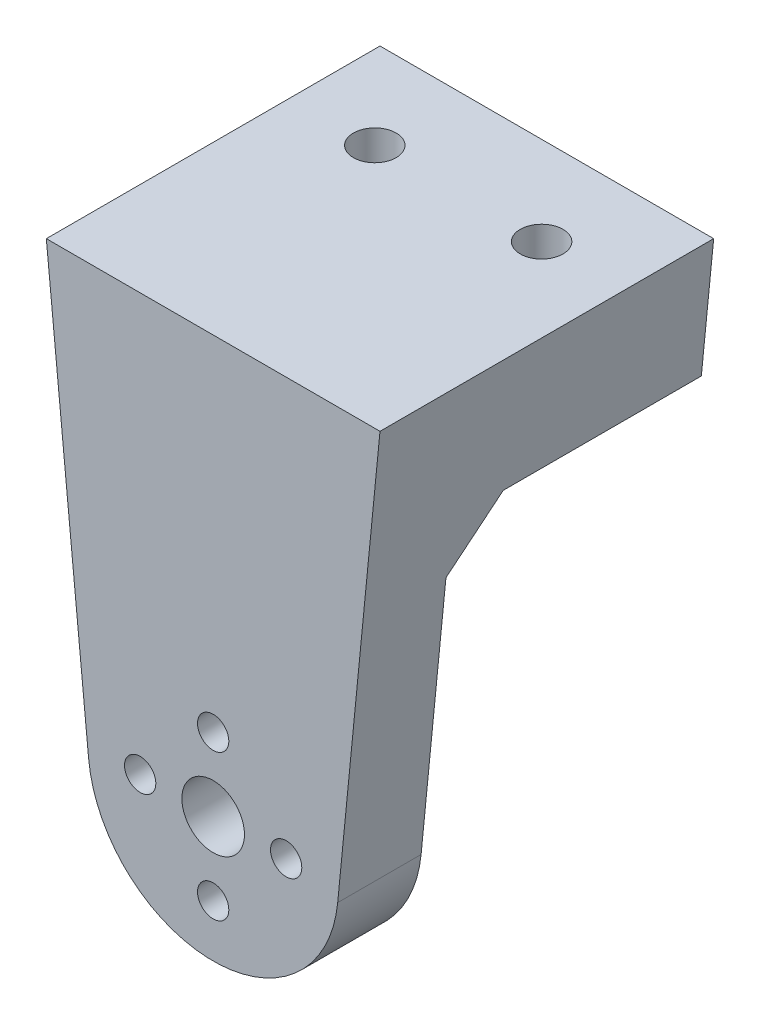
ISO-10303-21;
HEADER;
FILE_DESCRIPTION(('STEP AP214'),'2;1');
FILE_NAME('part.step','',(''),(''),'','','');
FILE_SCHEMA(('AUTOMOTIVE_DESIGN { 1 0 10303 214 1 1 1 1 }'));
ENDSEC;
DATA;
#1=APPLICATION_CONTEXT('core data for automotive mechanical design processes');
#2=APPLICATION_PROTOCOL_DEFINITION('international standard','automotive_design',2000,#1);
#3=PRODUCT_CONTEXT('',#1,'mechanical');
#4=PRODUCT('Part','Part','',(#3));
#5=PRODUCT_RELATED_PRODUCT_CATEGORY('part','',(#4));
#6=PRODUCT_DEFINITION_FORMATION('','',#4);
#7=PRODUCT_DEFINITION_CONTEXT('part definition',#1,'design');
#8=PRODUCT_DEFINITION('design','',#6,#7);
#9=PRODUCT_DEFINITION_SHAPE('','',#8);
#10=(LENGTH_UNIT() NAMED_UNIT(*) SI_UNIT(.MILLI.,.METRE.));
#11=(NAMED_UNIT(*) PLANE_ANGLE_UNIT() SI_UNIT($,.RADIAN.));
#12=(NAMED_UNIT(*) SI_UNIT($,.STERADIAN.) SOLID_ANGLE_UNIT());
#13=UNCERTAINTY_MEASURE_WITH_UNIT(LENGTH_MEASURE(1.E-05),#10,'distance_accuracy_value','');
#14=(GEOMETRIC_REPRESENTATION_CONTEXT(3) GLOBAL_UNCERTAINTY_ASSIGNED_CONTEXT((#13)) GLOBAL_UNIT_ASSIGNED_CONTEXT((#10,
#11,#12)) REPRESENTATION_CONTEXT('',''));
#15=CARTESIAN_POINT('',(0.,0.,0.));
#16=DIRECTION('',(0.,0.,1.));
#17=DIRECTION('',(1.,0.,0.));
#18=AXIS2_PLACEMENT_3D('',#15,#16,#17);
#19=CARTESIAN_POINT('',(0.,0.,0.));
#20=DIRECTION('',(0.,0.,1.));
#21=DIRECTION('',(1.,0.,0.));
#22=AXIS2_PLACEMENT_3D('',#19,#20,#21);
#23=PLANE('',#22);
#24=CARTESIAN_POINT('',(0.,0.,0.));
#25=DIRECTION('',(0.,0.,-1.));
#26=DIRECTION('',(-1.,0.,0.));
#27=AXIS2_PLACEMENT_3D('',#24,#25,#26);
#28=CIRCLE('',#27,3.);
#29=CARTESIAN_POINT('',(-3.,0.,0.));
#30=VERTEX_POINT('',#29);
#31=EDGE_CURVE('E116',#30,#30,#28,.T.);
#32=ORIENTED_EDGE('',*,*,#31,.F.);
#33=EDGE_LOOP('',(#32));
#34=FACE_BOUND('',#33,.T.);
#35=CARTESIAN_POINT('',(7.,0.,0.));
#36=DIRECTION('',(0.,0.,1.));
#37=DIRECTION('',(1.,0.,0.));
#38=AXIS2_PLACEMENT_3D('',#35,#36,#37);
#39=CIRCLE('',#38,1.5);
#40=CARTESIAN_POINT('',(8.5,0.,0.));
#41=VERTEX_POINT('',#40);
#42=EDGE_CURVE('E158',#41,#41,#39,.T.);
#43=ORIENTED_EDGE('',*,*,#42,.T.);
#44=EDGE_LOOP('',(#43));
#45=FACE_BOUND('',#44,.T.);
#46=CARTESIAN_POINT('',(0.,-7.,0.));
#47=DIRECTION('',(0.,0.,1.));
#48=DIRECTION('',(1.,0.,0.));
#49=AXIS2_PLACEMENT_3D('',#46,#47,#48);
#50=CIRCLE('',#49,1.5);
#51=CARTESIAN_POINT('',(1.5,-7.,0.));
#52=VERTEX_POINT('',#51);
#53=EDGE_CURVE('E155',#52,#52,#50,.T.);
#54=ORIENTED_EDGE('',*,*,#53,.T.);
#55=EDGE_LOOP('',(#54));
#56=FACE_BOUND('',#55,.T.);
#57=CARTESIAN_POINT('',(-7.,0.,0.));
#58=DIRECTION('',(0.,0.,1.));
#59=DIRECTION('',(1.,0.,0.));
#60=AXIS2_PLACEMENT_3D('',#57,#58,#59);
#61=CIRCLE('',#60,1.5);
#62=CARTESIAN_POINT('',(-5.5,0.,0.));
#63=VERTEX_POINT('',#62);
#64=EDGE_CURVE('E123',#63,#63,#61,.T.);
#65=ORIENTED_EDGE('',*,*,#64,.T.);
#66=EDGE_LOOP('',(#65));
#67=FACE_BOUND('',#66,.T.);
#68=CARTESIAN_POINT('',(0.,7.,0.));
#69=DIRECTION('',(0.,0.,1.));
#70=DIRECTION('',(1.,0.,0.));
#71=AXIS2_PLACEMENT_3D('',#68,#69,#70);
#72=CIRCLE('',#71,1.5);
#73=CARTESIAN_POINT('',(1.5,7.,0.));
#74=VERTEX_POINT('',#73);
#75=EDGE_CURVE('E120',#74,#74,#72,.T.);
#76=ORIENTED_EDGE('',*,*,#75,.T.);
#77=EDGE_LOOP('',(#76));
#78=FACE_BOUND('',#77,.T.);
#79=DIRECTION('',(-0.0980717390616762,0.99517934765419,0.));
#80=VECTOR('',#79,1.);
#81=CARTESIAN_POINT('',(-11.9421521718503,-1.17686086874011,0.));
#82=LINE('',#81,#80);
#83=CARTESIAN_POINT('',(-11.9421521718503,-1.17686086874012,0.));
#84=VERTEX_POINT('',#83);
#85=CARTESIAN_POINT('',(-14.324704418376,23.,0.));
#86=VERTEX_POINT('',#85);
#87=EDGE_CURVE('E132',#84,#86,#82,.T.);
#88=ORIENTED_EDGE('',*,*,#87,.T.);
#89=DIRECTION('',(1.,0.,0.));
#90=VECTOR('',#89,1.);
#91=CARTESIAN_POINT('',(14.8174384129713,23.,0.));
#92=LINE('',#91,#90);
#93=CARTESIAN_POINT('',(14.324704418376,23.,0.));
#94=VERTEX_POINT('',#93);
#95=EDGE_CURVE('E59',#86,#94,#92,.T.);
#96=ORIENTED_EDGE('',*,*,#95,.T.);
#97=DIRECTION('',(-0.0980717390616759,-0.99517934765419,0.));
#98=VECTOR('',#97,1.);
#99=CARTESIAN_POINT('',(11.9421521718503,-1.17686086874011,0.));
#100=LINE('',#99,#98);
#101=CARTESIAN_POINT('',(11.9421521718503,-1.17686086874011,0.));
#102=VERTEX_POINT('',#101);
#103=EDGE_CURVE('E164',#94,#102,#100,.T.);
#104=ORIENTED_EDGE('',*,*,#103,.T.);
#105=CARTESIAN_POINT('',(0.,0.,0.));
#106=DIRECTION('',(0.,0.,1.));
#107=DIRECTION('',(1.,0.,0.));
#108=AXIS2_PLACEMENT_3D('',#105,#106,#107);
#109=CIRCLE('',#108,12.);
#110=EDGE_CURVE('E161',#84,#102,#109,.T.);
#111=ORIENTED_EDGE('',*,*,#110,.F.);
#112=EDGE_LOOP('',(#88,#96,#104,#111));
#113=FACE_BOUND('',#112,.T.);
#114=ADVANCED_FACE('F37',(#34,#45,#56,#67,#78,#113),#23,.F.);
#115=CARTESIAN_POINT('',(0.,0.,8.));
#116=DIRECTION('',(0.,0.,-1.));
#117=DIRECTION('',(-1.,0.,0.));
#118=AXIS2_PLACEMENT_3D('',#115,#116,#117);
#119=CYLINDRICAL_SURFACE('',#118,12.);
#120=ORIENTED_EDGE('',*,*,#110,.T.);
#121=DIRECTION('',(0.,0.,-1.));
#122=VECTOR('',#121,1.);
#123=CARTESIAN_POINT('',(11.9421521718503,-1.17686086874011,8.));
#124=LINE('',#123,#122);
#125=CARTESIAN_POINT('',(11.9421521718503,-1.17686086874011,8.));
#126=VERTEX_POINT('',#125);
#127=EDGE_CURVE('E172',#126,#102,#124,.T.);
#128=ORIENTED_EDGE('',*,*,#127,.F.);
#129=CARTESIAN_POINT('',(0.,0.,8.));
#130=DIRECTION('',(0.,0.,1.));
#131=DIRECTION('',(1.,0.,0.));
#132=AXIS2_PLACEMENT_3D('',#129,#130,#131);
#133=CIRCLE('',#132,12.);
#134=CARTESIAN_POINT('',(-11.9421521718503,-1.17686086874012,8.));
#135=VERTEX_POINT('',#134);
#136=EDGE_CURVE('E141',#135,#126,#133,.T.);
#137=ORIENTED_EDGE('',*,*,#136,.F.);
#138=DIRECTION('',(0.,0.,-1.));
#139=VECTOR('',#138,1.);
#140=CARTESIAN_POINT('',(-11.9421521718503,-1.17686086874012,8.));
#141=LINE('',#140,#139);
#142=EDGE_CURVE('E151',#135,#84,#141,.T.);
#143=ORIENTED_EDGE('',*,*,#142,.T.);
#144=EDGE_LOOP('',(#120,#128,#137,#143));
#145=FACE_BOUND('',#144,.T.);
#146=ADVANCED_FACE('F211',(#145),#119,.T.);
#147=CARTESIAN_POINT('',(11.9421521718503,-1.17686086874011,8.));
#148=DIRECTION('',(0.99517934765419,-0.0980717390616759,0.));
#149=DIRECTION('',(0.0980717390616759,0.99517934765419,0.));
#150=AXIS2_PLACEMENT_3D('',#147,#148,#149);
#151=PLANE('',#150);
#152=ORIENTED_EDGE('',*,*,#103,.F.);
#153=DIRECTION('',(-0.0695145420373916,-0.705396246249341,0.705396246249348));
#154=VECTOR('',#153,1.);
#155=CARTESIAN_POINT('',(14.6742346406592,26.5468450128987,-3.54684501289869));
#156=LINE('',#155,#154);
#157=CARTESIAN_POINT('',(14.8174384129713,28.,-5.00000000000004));
#158=VERTEX_POINT('',#157);
#159=EDGE_CURVE('E11',#94,#158,#156,.F.);
#160=ORIENTED_EDGE('',*,*,#159,.T.);
#161=DIRECTION('',(0.,0.,1.));
#162=VECTOR('',#161,1.);
#163=CARTESIAN_POINT('',(14.8174384129713,28.,-24.));
#164=LINE('',#163,#162);
#165=CARTESIAN_POINT('',(14.8174384129713,28.,-24.));
#166=VERTEX_POINT('',#165);
#167=EDGE_CURVE('E101',#166,#158,#164,.T.);
#168=ORIENTED_EDGE('',*,*,#167,.F.);
#169=DIRECTION('',(-0.0980717390616759,-0.99517934765419,0.));
#170=VECTOR('',#169,1.);
#171=CARTESIAN_POINT('',(16.,40.,-24.));
#172=LINE('',#171,#170);
#173=CARTESIAN_POINT('',(16.,40.,-24.));
#174=VERTEX_POINT('',#173);
#175=EDGE_CURVE('E108',#174,#166,#172,.T.);
#176=ORIENTED_EDGE('',*,*,#175,.F.);
#177=DIRECTION('',(0.,0.,-1.));
#178=VECTOR('',#177,1.);
#179=CARTESIAN_POINT('',(16.,40.,8.));
#180=LINE('',#179,#178);
#181=CARTESIAN_POINT('',(16.,40.,8.));
#182=VERTEX_POINT('',#181);
#183=EDGE_CURVE('E170',#182,#174,#180,.T.);
#184=ORIENTED_EDGE('',*,*,#183,.F.);
#185=DIRECTION('',(-0.0980717390616759,-0.99517934765419,0.));
#186=VECTOR('',#185,1.);
#187=CARTESIAN_POINT('',(11.9421521718503,-1.17686086874011,8.));
#188=LINE('',#187,#186);
#189=EDGE_CURVE('E143',#182,#126,#188,.T.);
#190=ORIENTED_EDGE('',*,*,#189,.T.);
#191=ORIENTED_EDGE('',*,*,#127,.T.);
#192=EDGE_LOOP('',(#152,#160,#168,#176,#184,#190,#191));
#193=FACE_BOUND('',#192,.T.);
#194=ADVANCED_FACE('F118',(#193),#151,.T.);
#195=CARTESIAN_POINT('',(0.,40.,8.));
#196=DIRECTION('',(0.,1.,0.));
#197=DIRECTION('',(-1.,0.,0.));
#198=AXIS2_PLACEMENT_3D('',#195,#196,#197);
#199=PLANE('',#198);
#200=CARTESIAN_POINT('',(-8.00000000000001,40.,-15.5));
#201=DIRECTION('',(0.,1.,0.));
#202=DIRECTION('',(-1.,0.,0.));
#203=AXIS2_PLACEMENT_3D('',#200,#201,#202);
#204=CIRCLE('',#203,2.05);
#205=CARTESIAN_POINT('',(-10.05,40.,-15.5));
#206=VERTEX_POINT('',#205);
#207=EDGE_CURVE('E193',#206,#206,#204,.F.);
#208=ORIENTED_EDGE('',*,*,#207,.T.);
#209=EDGE_LOOP('',(#208));
#210=FACE_BOUND('',#209,.T.);
#211=CARTESIAN_POINT('',(7.99999999999999,40.,-15.5));
#212=DIRECTION('',(0.,-1.,0.));
#213=DIRECTION('',(1.,0.,0.));
#214=AXIS2_PLACEMENT_3D('',#211,#212,#213);
#215=CIRCLE('',#214,2.05);
#216=CARTESIAN_POINT('',(10.05,40.,-15.5));
#217=VERTEX_POINT('',#216);
#218=EDGE_CURVE('E190',#217,#217,#215,.T.);
#219=ORIENTED_EDGE('',*,*,#218,.T.);
#220=EDGE_LOOP('',(#219));
#221=FACE_BOUND('',#220,.T.);
#222=ORIENTED_EDGE('',*,*,#183,.T.);
#223=DIRECTION('',(1.,0.,0.));
#224=VECTOR('',#223,1.);
#225=CARTESIAN_POINT('',(-16.,40.,-24.));
#226=LINE('',#225,#224);
#227=CARTESIAN_POINT('',(-16.,40.,-24.));
#228=VERTEX_POINT('',#227);
#229=EDGE_CURVE('E114',#228,#174,#226,.T.);
#230=ORIENTED_EDGE('',*,*,#229,.F.);
#231=DIRECTION('',(0.,0.,-1.));
#232=VECTOR('',#231,1.);
#233=CARTESIAN_POINT('',(-16.,40.,8.));
#234=LINE('',#233,#232);
#235=CARTESIAN_POINT('',(-16.,40.,8.));
#236=VERTEX_POINT('',#235);
#237=EDGE_CURVE('E168',#236,#228,#234,.T.);
#238=ORIENTED_EDGE('',*,*,#237,.F.);
#239=DIRECTION('',(1.,0.,0.));
#240=VECTOR('',#239,1.);
#241=CARTESIAN_POINT('',(0.,40.,8.));
#242=LINE('',#241,#240);
#243=EDGE_CURVE('E146',#236,#182,#242,.T.);
#244=ORIENTED_EDGE('',*,*,#243,.T.);
#245=EDGE_LOOP('',(#222,#230,#238,#244));
#246=FACE_BOUND('',#245,.T.);
#247=ADVANCED_FACE('F228',(#210,#221,#246),#199,.T.);
#248=CARTESIAN_POINT('',(7.,0.,8.));
#249=DIRECTION('',(0.,0.,-1.));
#250=DIRECTION('',(-1.,0.,0.));
#251=AXIS2_PLACEMENT_3D('',#248,#249,#250);
#252=CYLINDRICAL_SURFACE('',#251,1.5);
#253=CARTESIAN_POINT('',(7.,0.,8.));
#254=DIRECTION('',(0.,0.,1.));
#255=DIRECTION('',(1.,0.,0.));
#256=AXIS2_PLACEMENT_3D('',#253,#254,#255);
#257=CIRCLE('',#256,1.5);
#258=CARTESIAN_POINT('',(8.5,0.,8.));
#259=VERTEX_POINT('',#258);
#260=EDGE_CURVE('E138',#259,#259,#257,.T.);
#261=ORIENTED_EDGE('',*,*,#260,.T.);
#262=EDGE_LOOP('',(#261));
#263=FACE_BOUND('',#262,.T.);
#264=ORIENTED_EDGE('',*,*,#42,.F.);
#265=EDGE_LOOP('',(#264));
#266=FACE_BOUND('',#265,.T.);
#267=ADVANCED_FACE('F231',(#263,#266),#252,.F.);
#268=CARTESIAN_POINT('',(0.,-7.,8.));
#269=DIRECTION('',(0.,0.,-1.));
#270=DIRECTION('',(-1.,0.,0.));
#271=AXIS2_PLACEMENT_3D('',#268,#269,#270);
#272=CYLINDRICAL_SURFACE('',#271,1.5);
#273=CARTESIAN_POINT('',(0.,-7.,8.));
#274=DIRECTION('',(0.,0.,1.));
#275=DIRECTION('',(1.,0.,0.));
#276=AXIS2_PLACEMENT_3D('',#273,#274,#275);
#277=CIRCLE('',#276,1.5);
#278=CARTESIAN_POINT('',(1.5,-7.,8.));
#279=VERTEX_POINT('',#278);
#280=EDGE_CURVE('E135',#279,#279,#277,.T.);
#281=ORIENTED_EDGE('',*,*,#280,.T.);
#282=EDGE_LOOP('',(#281));
#283=FACE_BOUND('',#282,.T.);
#284=ORIENTED_EDGE('',*,*,#53,.F.);
#285=EDGE_LOOP('',(#284));
#286=FACE_BOUND('',#285,.T.);
#287=ADVANCED_FACE('F237',(#283,#286),#272,.F.);
#288=CARTESIAN_POINT('',(-7.,0.,8.));
#289=DIRECTION('',(0.,0.,-1.));
#290=DIRECTION('',(-1.,0.,0.));
#291=AXIS2_PLACEMENT_3D('',#288,#289,#290);
#292=CYLINDRICAL_SURFACE('',#291,1.5);
#293=CARTESIAN_POINT('',(-7.,0.,8.));
#294=DIRECTION('',(0.,0.,1.));
#295=DIRECTION('',(1.,0.,0.));
#296=AXIS2_PLACEMENT_3D('',#293,#294,#295);
#297=CIRCLE('',#296,1.5);
#298=CARTESIAN_POINT('',(-5.5,0.,8.));
#299=VERTEX_POINT('',#298);
#300=EDGE_CURVE('E131',#299,#299,#297,.T.);
#301=ORIENTED_EDGE('',*,*,#300,.T.);
#302=EDGE_LOOP('',(#301));
#303=FACE_BOUND('',#302,.T.);
#304=ORIENTED_EDGE('',*,*,#64,.F.);
#305=EDGE_LOOP('',(#304));
#306=FACE_BOUND('',#305,.T.);
#307=ADVANCED_FACE('F241',(#303,#306),#292,.F.);
#308=CARTESIAN_POINT('',(0.,7.,8.));
#309=DIRECTION('',(0.,0.,-1.));
#310=DIRECTION('',(-1.,0.,0.));
#311=AXIS2_PLACEMENT_3D('',#308,#309,#310);
#312=CYLINDRICAL_SURFACE('',#311,1.5);
#313=CARTESIAN_POINT('',(0.,7.,8.));
#314=DIRECTION('',(0.,0.,1.));
#315=DIRECTION('',(1.,0.,0.));
#316=AXIS2_PLACEMENT_3D('',#313,#314,#315);
#317=CIRCLE('',#316,1.5);
#318=CARTESIAN_POINT('',(1.5,7.,8.));
#319=VERTEX_POINT('',#318);
#320=EDGE_CURVE('E128',#319,#319,#317,.T.);
#321=ORIENTED_EDGE('',*,*,#320,.T.);
#322=EDGE_LOOP('',(#321));
#323=FACE_BOUND('',#322,.T.);
#324=ORIENTED_EDGE('',*,*,#75,.F.);
#325=EDGE_LOOP('',(#324));
#326=FACE_BOUND('',#325,.T.);
#327=ADVANCED_FACE('F227',(#323,#326),#312,.F.);
#328=CARTESIAN_POINT('',(-11.9421521718503,-1.17686086874011,8.));
#329=DIRECTION('',(-0.99517934765419,-0.0980717390616762,0.));
#330=DIRECTION('',(0.0980717390616762,-0.99517934765419,0.));
#331=AXIS2_PLACEMENT_3D('',#328,#329,#330);
#332=PLANE('',#331);
#333=ORIENTED_EDGE('',*,*,#87,.F.);
#334=ORIENTED_EDGE('',*,*,#142,.F.);
#335=DIRECTION('',(-0.0980717390616762,0.99517934765419,0.));
#336=VECTOR('',#335,1.);
#337=CARTESIAN_POINT('',(-11.9421521718503,-1.17686086874011,8.));
#338=LINE('',#337,#336);
#339=EDGE_CURVE('E149',#135,#236,#338,.T.);
#340=ORIENTED_EDGE('',*,*,#339,.T.);
#341=ORIENTED_EDGE('',*,*,#237,.T.);
#342=DIRECTION('',(-0.0980717390616758,0.99517934765419,0.));
#343=VECTOR('',#342,1.);
#344=CARTESIAN_POINT('',(-14.8174384129713,28.,-24.));
#345=LINE('',#344,#343);
#346=CARTESIAN_POINT('',(-14.8174384129713,28.,-24.));
#347=VERTEX_POINT('',#346);
#348=EDGE_CURVE('E107',#347,#228,#345,.T.);
#349=ORIENTED_EDGE('',*,*,#348,.F.);
#350=DIRECTION('',(0.,0.,1.));
#351=VECTOR('',#350,1.);
#352=CARTESIAN_POINT('',(-14.8174384129713,28.,-24.));
#353=LINE('',#352,#351);
#354=CARTESIAN_POINT('',(-14.8174384129713,28.,-5.00000000000004));
#355=VERTEX_POINT('',#354);
#356=EDGE_CURVE('E103',#347,#355,#353,.T.);
#357=ORIENTED_EDGE('',*,*,#356,.T.);
#358=DIRECTION('',(-0.0695145420373917,0.705396246249341,-0.705396246249348));
#359=VECTOR('',#358,1.);
#360=CARTESIAN_POINT('',(-14.8174384129713,28.,-5.00000000000004));
#361=LINE('',#360,#359);
#362=EDGE_CURVE('E46',#355,#86,#361,.F.);
#363=ORIENTED_EDGE('',*,*,#362,.T.);
#364=EDGE_LOOP('',(#333,#334,#340,#341,#349,#357,#363));
#365=FACE_BOUND('',#364,.T.);
#366=ADVANCED_FACE('F178',(#365),#332,.T.);
#367=CARTESIAN_POINT('',(0.,0.,8.));
#368=DIRECTION('',(0.,0.,1.));
#369=DIRECTION('',(1.,0.,0.));
#370=AXIS2_PLACEMENT_3D('',#367,#368,#369);
#371=PLANE('',#370);
#372=CARTESIAN_POINT('',(0.,0.,8.));
#373=DIRECTION('',(0.,0.,1.));
#374=DIRECTION('',(1.,0.,0.));
#375=AXIS2_PLACEMENT_3D('',#372,#373,#374);
#376=CIRCLE('',#375,3.);
#377=CARTESIAN_POINT('',(3.,0.,8.));
#378=VERTEX_POINT('',#377);
#379=EDGE_CURVE('E181',#378,#378,#376,.F.);
#380=ORIENTED_EDGE('',*,*,#379,.T.);
#381=EDGE_LOOP('',(#380));
#382=FACE_BOUND('',#381,.T.);
#383=ORIENTED_EDGE('',*,*,#320,.F.);
#384=EDGE_LOOP('',(#383));
#385=FACE_BOUND('',#384,.T.);
#386=ORIENTED_EDGE('',*,*,#300,.F.);
#387=EDGE_LOOP('',(#386));
#388=FACE_BOUND('',#387,.T.);
#389=ORIENTED_EDGE('',*,*,#280,.F.);
#390=EDGE_LOOP('',(#389));
#391=FACE_BOUND('',#390,.T.);
#392=ORIENTED_EDGE('',*,*,#260,.F.);
#393=EDGE_LOOP('',(#392));
#394=FACE_BOUND('',#393,.T.);
#395=ORIENTED_EDGE('',*,*,#136,.T.);
#396=ORIENTED_EDGE('',*,*,#189,.F.);
#397=ORIENTED_EDGE('',*,*,#243,.F.);
#398=ORIENTED_EDGE('',*,*,#339,.F.);
#399=EDGE_LOOP('',(#395,#396,#397,#398));
#400=FACE_BOUND('',#399,.T.);
#401=ADVANCED_FACE('F223',(#382,#385,#388,#391,#394,#400),#371,.T.);
#402=CARTESIAN_POINT('',(-14.8174384129713,28.,-24.));
#403=DIRECTION('',(0.,1.,0.));
#404=DIRECTION('',(-1.,0.,0.));
#405=AXIS2_PLACEMENT_3D('',#402,#403,#404);
#406=PLANE('',#405);
#407=ORIENTED_EDGE('',*,*,#167,.T.);
#408=DIRECTION('',(-1.,0.,0.));
#409=VECTOR('',#408,1.);
#410=CARTESIAN_POINT('',(-14.8174384129713,28.,-5.00000000000004));
#411=LINE('',#410,#409);
#412=EDGE_CURVE('E175',#158,#355,#411,.T.);
#413=ORIENTED_EDGE('',*,*,#412,.T.);
#414=ORIENTED_EDGE('',*,*,#356,.F.);
#415=DIRECTION('',(-1.,0.,0.));
#416=VECTOR('',#415,1.);
#417=CARTESIAN_POINT('',(-14.8174384129713,28.,-24.));
#418=LINE('',#417,#416);
#419=EDGE_CURVE('E96',#166,#347,#418,.T.);
#420=ORIENTED_EDGE('',*,*,#419,.F.);
#421=EDGE_LOOP('',(#407,#413,#414,#420));
#422=FACE_BOUND('',#421,.T.);
#423=ADVANCED_FACE('F98',(#422),#406,.F.);
#424=CARTESIAN_POINT('',(0.,0.,-24.));
#425=DIRECTION('',(0.,0.,1.));
#426=DIRECTION('',(1.,0.,0.));
#427=AXIS2_PLACEMENT_3D('',#424,#425,#426);
#428=PLANE('',#427);
#429=ORIENTED_EDGE('',*,*,#175,.T.);
#430=ORIENTED_EDGE('',*,*,#419,.T.);
#431=ORIENTED_EDGE('',*,*,#348,.T.);
#432=ORIENTED_EDGE('',*,*,#229,.T.);
#433=EDGE_LOOP('',(#429,#430,#431,#432));
#434=FACE_BOUND('',#433,.T.);
#435=ADVANCED_FACE('F112',(#434),#428,.F.);
#436=CARTESIAN_POINT('',(-14.8174384129713,28.,-5.00000000000004));
#437=DIRECTION('',(0.,-0.707106781186551,-0.707106781186544));
#438=DIRECTION('',(1.,0.,0.));
#439=AXIS2_PLACEMENT_3D('',#436,#437,#438);
#440=PLANE('',#439);
#441=ORIENTED_EDGE('',*,*,#159,.F.);
#442=ORIENTED_EDGE('',*,*,#95,.F.);
#443=ORIENTED_EDGE('',*,*,#362,.F.);
#444=ORIENTED_EDGE('',*,*,#412,.F.);
#445=EDGE_LOOP('',(#441,#442,#443,#444));
#446=FACE_BOUND('',#445,.T.);
#447=ADVANCED_FACE('F40',(#446),#440,.T.);
#448=CARTESIAN_POINT('',(0.,0.,8.001));
#449=DIRECTION('',(0.,0.,-1.));
#450=DIRECTION('',(-1.,0.,0.));
#451=AXIS2_PLACEMENT_3D('',#448,#449,#450);
#452=CYLINDRICAL_SURFACE('',#451,3.);
#453=ORIENTED_EDGE('',*,*,#379,.F.);
#454=EDGE_LOOP('',(#453));
#455=FACE_BOUND('',#454,.T.);
#456=ORIENTED_EDGE('',*,*,#31,.T.);
#457=EDGE_LOOP('',(#456));
#458=FACE_BOUND('',#457,.T.);
#459=ADVANCED_FACE('F255',(#455,#458),#452,.F.);
#460=CARTESIAN_POINT('',(7.99999999999999,35.,-15.5));
#461=DIRECTION('',(0.,1.,0.));
#462=DIRECTION('',(-1.,0.,0.));
#463=AXIS2_PLACEMENT_3D('',#460,#461,#462);
#464=CYLINDRICAL_SURFACE('',#463,2.05);
#465=CARTESIAN_POINT('',(7.99999999999999,35.,-15.5));
#466=DIRECTION('',(0.,-1.,0.));
#467=DIRECTION('',(1.,0.,0.));
#468=AXIS2_PLACEMENT_3D('',#465,#466,#467);
#469=CIRCLE('',#468,2.05);
#470=CARTESIAN_POINT('',(10.05,35.,-15.5));
#471=VERTEX_POINT('',#470);
#472=EDGE_CURVE('E187',#471,#471,#469,.T.);
#473=ORIENTED_EDGE('',*,*,#472,.T.);
#474=EDGE_LOOP('',(#473));
#475=FACE_BOUND('',#474,.T.);
#476=ORIENTED_EDGE('',*,*,#218,.F.);
#477=EDGE_LOOP('',(#476));
#478=FACE_BOUND('',#477,.T.);
#479=ADVANCED_FACE('F260',(#475,#478),#464,.F.);
#480=CARTESIAN_POINT('',(7.99999999999999,35.,-15.5));
#481=DIRECTION('',(0.,-1.,0.));
#482=DIRECTION('',(1.,0.,0.));
#483=AXIS2_PLACEMENT_3D('',#480,#481,#482);
#484=PLANE('',#483);
#485=ORIENTED_EDGE('',*,*,#472,.F.);
#486=EDGE_LOOP('',(#485));
#487=FACE_BOUND('',#486,.T.);
#488=ADVANCED_FACE('F208',(#487),#484,.F.);
#489=CARTESIAN_POINT('',(-8.00000000000001,35.,-15.5));
#490=DIRECTION('',(0.,1.,0.));
#491=DIRECTION('',(-1.,0.,0.));
#492=AXIS2_PLACEMENT_3D('',#489,#490,#491);
#493=CYLINDRICAL_SURFACE('',#492,2.05);
#494=CARTESIAN_POINT('',(-8.00000000000001,35.,-15.5));
#495=DIRECTION('',(0.,1.,0.));
#496=DIRECTION('',(-1.,0.,0.));
#497=AXIS2_PLACEMENT_3D('',#494,#495,#496);
#498=CIRCLE('',#497,2.05);
#499=CARTESIAN_POINT('',(-10.05,35.,-15.5));
#500=VERTEX_POINT('',#499);
#501=EDGE_CURVE('E184',#500,#500,#498,.F.);
#502=ORIENTED_EDGE('',*,*,#501,.T.);
#503=EDGE_LOOP('',(#502));
#504=FACE_BOUND('',#503,.T.);
#505=ORIENTED_EDGE('',*,*,#207,.F.);
#506=EDGE_LOOP('',(#505));
#507=FACE_BOUND('',#506,.T.);
#508=ADVANCED_FACE('F199',(#504,#507),#493,.F.);
#509=CARTESIAN_POINT('',(0.,35.,0.));
#510=DIRECTION('',(0.,1.,0.));
#511=DIRECTION('',(-1.,0.,0.));
#512=AXIS2_PLACEMENT_3D('',#509,#510,#511);
#513=PLANE('',#512);
#514=ORIENTED_EDGE('',*,*,#501,.F.);
#515=EDGE_LOOP('',(#514));
#516=FACE_BOUND('',#515,.T.);
#517=ADVANCED_FACE('F202',(#516),#513,.T.);
#518=CLOSED_SHELL('',(#114,#146,#194,#247,#267,#287,#307,#327,#366,#401,#423,#435,#447,#459,
#479,#488,#508,#517));
#519=MANIFOLD_SOLID_BREP('B2',#518);
#520=ADVANCED_BREP_SHAPE_REPRESENTATION('',(#18,#519),#14);
#521=SHAPE_DEFINITION_REPRESENTATION(#9,#520);
ENDSEC;
END-ISO-10303-21;
